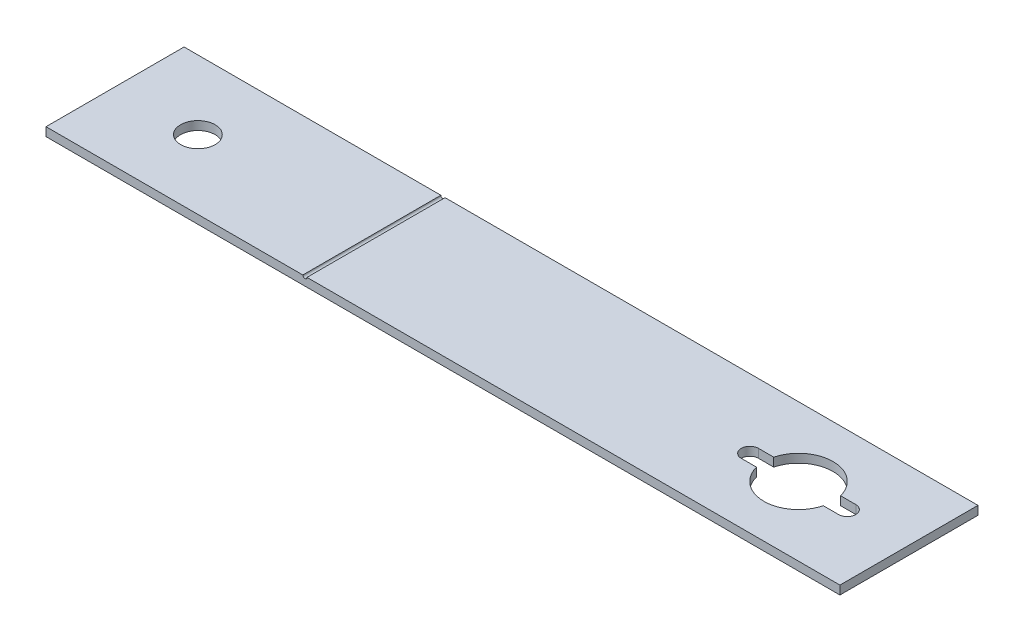
ISO-10303-21;
HEADER;
FILE_DESCRIPTION(('STEP AP214'),'2;1');
FILE_NAME('part.step','',(''),(''),'','','');
FILE_SCHEMA(('AUTOMOTIVE_DESIGN { 1 0 10303 214 1 1 1 1 }'));
ENDSEC;
DATA;
#1=APPLICATION_CONTEXT('core data for automotive mechanical design processes');
#2=APPLICATION_PROTOCOL_DEFINITION('international standard','automotive_design',2000,#1);
#3=PRODUCT_CONTEXT('',#1,'mechanical');
#4=PRODUCT('Part','Part','',(#3));
#5=PRODUCT_RELATED_PRODUCT_CATEGORY('part','',(#4));
#6=PRODUCT_DEFINITION_FORMATION('','',#4);
#7=PRODUCT_DEFINITION_CONTEXT('part definition',#1,'design');
#8=PRODUCT_DEFINITION('design','',#6,#7);
#9=PRODUCT_DEFINITION_SHAPE('','',#8);
#10=(LENGTH_UNIT() NAMED_UNIT(*) SI_UNIT(.MILLI.,.METRE.));
#11=(NAMED_UNIT(*) PLANE_ANGLE_UNIT() SI_UNIT($,.RADIAN.));
#12=(NAMED_UNIT(*) SI_UNIT($,.STERADIAN.) SOLID_ANGLE_UNIT());
#13=UNCERTAINTY_MEASURE_WITH_UNIT(LENGTH_MEASURE(1.E-05),#10,'distance_accuracy_value','');
#14=(GEOMETRIC_REPRESENTATION_CONTEXT(3) GLOBAL_UNCERTAINTY_ASSIGNED_CONTEXT((#13)) GLOBAL_UNIT_ASSIGNED_CONTEXT((#10,
#11,#12)) REPRESENTATION_CONTEXT('',''));
#15=CARTESIAN_POINT('',(0.,0.,0.));
#16=DIRECTION('',(0.,0.,1.));
#17=DIRECTION('',(1.,0.,0.));
#18=AXIS2_PLACEMENT_3D('',#15,#16,#17);
#19=CARTESIAN_POINT('',(0.,0.,0.));
#20=DIRECTION('',(0.,-1.,0.));
#21=DIRECTION('',(0.,0.,-1.));
#22=AXIS2_PLACEMENT_3D('',#19,#20,#21);
#23=PLANE('',#22);
#24=DIRECTION('',(1.,0.,0.));
#25=VECTOR('',#24,1.);
#26=CARTESIAN_POINT('',(43.7515,0.,1.5875));
#27=LINE('',#26,#25);
#28=CARTESIAN_POINT('',(43.7515,0.,1.5875));
#29=VERTEX_POINT('',#28);
#30=CARTESIAN_POINT('',(46.5566389378957,0.,1.5875));
#31=VERTEX_POINT('',#30);
#32=EDGE_CURVE('E243',#29,#31,#27,.T.);
#33=ORIENTED_EDGE('',*,*,#32,.F.);
#34=CARTESIAN_POINT('',(43.7515,0.,0.));
#35=DIRECTION('',(0.,1.,0.));
#36=DIRECTION('',(0.,0.,1.));
#37=AXIS2_PLACEMENT_3D('',#34,#35,#36);
#38=CIRCLE('',#37,1.5875);
#39=CARTESIAN_POINT('',(43.7515,0.,-1.5875));
#40=VERTEX_POINT('',#39);
#41=EDGE_CURVE('E245',#40,#29,#38,.T.);
#42=ORIENTED_EDGE('',*,*,#41,.F.);
#43=DIRECTION('',(-1.,0.,0.));
#44=VECTOR('',#43,1.);
#45=CARTESIAN_POINT('',(43.7515,0.,-1.5875));
#46=LINE('',#45,#44);
#47=CARTESIAN_POINT('',(46.5566389378957,0.,-1.5875));
#48=VERTEX_POINT('',#47);
#49=EDGE_CURVE('E213',#48,#40,#46,.T.);
#50=ORIENTED_EDGE('',*,*,#49,.F.);
#51=CARTESIAN_POINT('',(52.705,0.,0.));
#52=DIRECTION('',(0.,1.,0.));
#53=DIRECTION('',(0.,0.,1.));
#54=AXIS2_PLACEMENT_3D('',#51,#52,#53);
#55=CIRCLE('',#54,6.35);
#56=CARTESIAN_POINT('',(58.8533610621043,0.,-1.5875));
#57=VERTEX_POINT('',#56);
#58=EDGE_CURVE('E228',#57,#48,#55,.T.);
#59=ORIENTED_EDGE('',*,*,#58,.F.);
#60=DIRECTION('',(-1.,0.,0.));
#61=VECTOR('',#60,1.);
#62=CARTESIAN_POINT('',(61.6585,0.,-1.5875));
#63=LINE('',#62,#61);
#64=CARTESIAN_POINT('',(61.6585,0.,-1.5875));
#65=VERTEX_POINT('',#64);
#66=EDGE_CURVE('E231',#65,#57,#63,.T.);
#67=ORIENTED_EDGE('',*,*,#66,.F.);
#68=CARTESIAN_POINT('',(61.6585,0.,0.));
#69=DIRECTION('',(0.,1.,0.));
#70=DIRECTION('',(0.,0.,1.));
#71=AXIS2_PLACEMENT_3D('',#68,#69,#70);
#72=CIRCLE('',#71,1.5875);
#73=CARTESIAN_POINT('',(61.6585,0.,1.5875));
#74=VERTEX_POINT('',#73);
#75=EDGE_CURVE('E234',#74,#65,#72,.T.);
#76=ORIENTED_EDGE('',*,*,#75,.F.);
#77=DIRECTION('',(1.,0.,0.));
#78=VECTOR('',#77,1.);
#79=CARTESIAN_POINT('',(61.6585,0.,1.5875));
#80=LINE('',#79,#78);
#81=CARTESIAN_POINT('',(58.8533610621043,0.,1.5875));
#82=VERTEX_POINT('',#81);
#83=EDGE_CURVE('E237',#82,#74,#80,.T.);
#84=ORIENTED_EDGE('',*,*,#83,.F.);
#85=CARTESIAN_POINT('',(52.705,0.,0.));
#86=DIRECTION('',(0.,1.,0.));
#87=DIRECTION('',(0.,0.,1.));
#88=AXIS2_PLACEMENT_3D('',#85,#86,#87);
#89=CIRCLE('',#88,6.35);
#90=EDGE_CURVE('E240',#31,#82,#89,.T.);
#91=ORIENTED_EDGE('',*,*,#90,.F.);
#92=EDGE_LOOP('',(#33,#42,#50,#59,#67,#76,#84,#91));
#93=FACE_BOUND('',#92,.T.);
#94=DIRECTION('',(-1.,0.,0.));
#95=VECTOR('',#94,1.);
#96=CARTESIAN_POINT('',(-73.025,0.,-12.7));
#97=LINE('',#96,#95);
#98=CARTESIAN_POINT('',(73.025,0.,-12.7));
#99=VERTEX_POINT('',#98);
#100=CARTESIAN_POINT('',(-25.0177724064553,0.,-12.7));
#101=VERTEX_POINT('',#100);
#102=EDGE_CURVE('E147',#99,#101,#97,.T.);
#103=ORIENTED_EDGE('',*,*,#102,.T.);
#104=DIRECTION('',(0.,0.,1.));
#105=VECTOR('',#104,1.);
#106=CARTESIAN_POINT('',(-25.0177724064553,0.,-12.954));
#107=LINE('',#106,#105);
#108=CARTESIAN_POINT('',(-25.0177724064553,0.,12.7));
#109=VERTEX_POINT('',#108);
#110=EDGE_CURVE('E11',#101,#109,#107,.T.);
#111=ORIENTED_EDGE('',*,*,#110,.T.);
#112=DIRECTION('',(1.,0.,0.));
#113=VECTOR('',#112,1.);
#114=CARTESIAN_POINT('',(-73.025,0.,12.7));
#115=LINE('',#114,#113);
#116=CARTESIAN_POINT('',(73.025,0.,12.7));
#117=VERTEX_POINT('',#116);
#118=EDGE_CURVE('E144',#109,#117,#115,.T.);
#119=ORIENTED_EDGE('',*,*,#118,.T.);
#120=DIRECTION('',(0.,0.,-1.));
#121=VECTOR('',#120,1.);
#122=CARTESIAN_POINT('',(73.025,0.,12.7));
#123=LINE('',#122,#121);
#124=EDGE_CURVE('E176',#117,#99,#123,.T.);
#125=ORIENTED_EDGE('',*,*,#124,.T.);
#126=EDGE_LOOP('',(#103,#111,#119,#125));
#127=FACE_BOUND('',#126,.T.);
#128=ADVANCED_FACE('F35',(#93,#127),#23,.F.);
#129=CARTESIAN_POINT('',(73.025,-1.5875,12.7));
#130=DIRECTION('',(1.,0.,0.));
#131=DIRECTION('',(0.,0.,-1.));
#132=AXIS2_PLACEMENT_3D('',#129,#130,#131);
#133=PLANE('',#132);
#134=ORIENTED_EDGE('',*,*,#124,.F.);
#135=DIRECTION('',(0.,1.,0.));
#136=VECTOR('',#135,1.);
#137=CARTESIAN_POINT('',(73.025,-1.5875,12.7));
#138=LINE('',#137,#136);
#139=CARTESIAN_POINT('',(73.025,-1.5875,12.7));
#140=VERTEX_POINT('',#139);
#141=EDGE_CURVE('E150',#140,#117,#138,.T.);
#142=ORIENTED_EDGE('',*,*,#141,.F.);
#143=DIRECTION('',(0.,0.,-1.));
#144=VECTOR('',#143,1.);
#145=CARTESIAN_POINT('',(73.025,-1.5875,12.7));
#146=LINE('',#145,#144);
#147=CARTESIAN_POINT('',(73.025,-1.5875,-12.7));
#148=VERTEX_POINT('',#147);
#149=EDGE_CURVE('E155',#140,#148,#146,.T.);
#150=ORIENTED_EDGE('',*,*,#149,.T.);
#151=DIRECTION('',(0.,1.,0.));
#152=VECTOR('',#151,1.);
#153=CARTESIAN_POINT('',(73.025,-1.5875,-12.7));
#154=LINE('',#153,#152);
#155=EDGE_CURVE('E166',#148,#99,#154,.T.);
#156=ORIENTED_EDGE('',*,*,#155,.T.);
#157=EDGE_LOOP('',(#134,#142,#150,#156));
#158=FACE_BOUND('',#157,.T.);
#159=ADVANCED_FACE('F37',(#158),#133,.T.);
#160=CARTESIAN_POINT('',(-73.025,-1.5875,12.7));
#161=DIRECTION('',(0.,0.,1.));
#162=DIRECTION('',(1.,0.,0.));
#163=AXIS2_PLACEMENT_3D('',#160,#161,#162);
#164=PLANE('',#163);
#165=CARTESIAN_POINT('',(-25.3987724064553,0.,12.7));
#166=DIRECTION('',(0.,0.,1.));
#167=DIRECTION('',(1.,0.,0.));
#168=AXIS2_PLACEMENT_3D('',#165,#166,#167);
#169=CIRCLE('',#168,0.380999999999998);
#170=CARTESIAN_POINT('',(-25.7797724064553,0.,12.7));
#171=VERTEX_POINT('',#170);
#172=EDGE_CURVE('E134',#171,#109,#169,.T.);
#173=ORIENTED_EDGE('',*,*,#172,.F.);
#174=CARTESIAN_POINT('',(-73.025,0.,12.7));
#175=VERTEX_POINT('',#174);
#176=EDGE_CURVE('E152',#175,#171,#115,.T.);
#177=ORIENTED_EDGE('',*,*,#176,.F.);
#178=DIRECTION('',(0.,1.,0.));
#179=VECTOR('',#178,1.);
#180=CARTESIAN_POINT('',(-73.025,-1.5875,12.7));
#181=LINE('',#180,#179);
#182=CARTESIAN_POINT('',(-73.025,-1.5875,12.7));
#183=VERTEX_POINT('',#182);
#184=EDGE_CURVE('E161',#183,#175,#181,.T.);
#185=ORIENTED_EDGE('',*,*,#184,.F.);
#186=DIRECTION('',(1.,0.,0.));
#187=VECTOR('',#186,1.);
#188=CARTESIAN_POINT('',(-73.025,-1.5875,12.7));
#189=LINE('',#188,#187);
#190=EDGE_CURVE('E167',#183,#140,#189,.T.);
#191=ORIENTED_EDGE('',*,*,#190,.T.);
#192=ORIENTED_EDGE('',*,*,#141,.T.);
#193=ORIENTED_EDGE('',*,*,#118,.F.);
#194=EDGE_LOOP('',(#173,#177,#185,#191,#192,#193));
#195=FACE_BOUND('',#194,.T.);
#196=ADVANCED_FACE('F148',(#195),#164,.T.);
#197=CARTESIAN_POINT('',(-73.025,-1.5875,12.7));
#198=DIRECTION('',(-1.,0.,0.));
#199=DIRECTION('',(0.,0.,1.));
#200=AXIS2_PLACEMENT_3D('',#197,#198,#199);
#201=PLANE('',#200);
#202=DIRECTION('',(0.,0.,1.));
#203=VECTOR('',#202,1.);
#204=CARTESIAN_POINT('',(-73.025,0.,12.7));
#205=LINE('',#204,#203);
#206=CARTESIAN_POINT('',(-73.025,0.,-12.7));
#207=VERTEX_POINT('',#206);
#208=EDGE_CURVE('E153',#207,#175,#205,.T.);
#209=ORIENTED_EDGE('',*,*,#208,.F.);
#210=DIRECTION('',(0.,1.,0.));
#211=VECTOR('',#210,1.);
#212=CARTESIAN_POINT('',(-73.025,-1.5875,-12.7));
#213=LINE('',#212,#211);
#214=CARTESIAN_POINT('',(-73.025,-1.5875,-12.7));
#215=VERTEX_POINT('',#214);
#216=EDGE_CURVE('E163',#215,#207,#213,.T.);
#217=ORIENTED_EDGE('',*,*,#216,.F.);
#218=DIRECTION('',(0.,0.,1.));
#219=VECTOR('',#218,1.);
#220=CARTESIAN_POINT('',(-73.025,-1.5875,12.7));
#221=LINE('',#220,#219);
#222=EDGE_CURVE('E181',#215,#183,#221,.T.);
#223=ORIENTED_EDGE('',*,*,#222,.T.);
#224=ORIENTED_EDGE('',*,*,#184,.T.);
#225=EDGE_LOOP('',(#209,#217,#223,#224));
#226=FACE_BOUND('',#225,.T.);
#227=ADVANCED_FACE('F319',(#226),#201,.T.);
#228=CARTESIAN_POINT('',(-73.025,-1.5875,-12.7));
#229=DIRECTION('',(0.,0.,-1.));
#230=DIRECTION('',(-1.,0.,0.));
#231=AXIS2_PLACEMENT_3D('',#228,#229,#230);
#232=PLANE('',#231);
#233=CARTESIAN_POINT('',(-25.3987724064553,0.,-12.7));
#234=DIRECTION('',(0.,0.,-1.));
#235=DIRECTION('',(-1.,0.,0.));
#236=AXIS2_PLACEMENT_3D('',#233,#234,#235);
#237=CIRCLE('',#236,0.380999999999998);
#238=CARTESIAN_POINT('',(-25.7797724064553,0.,-12.7));
#239=VERTEX_POINT('',#238);
#240=EDGE_CURVE('E50',#101,#239,#237,.T.);
#241=ORIENTED_EDGE('',*,*,#240,.F.);
#242=ORIENTED_EDGE('',*,*,#102,.F.);
#243=ORIENTED_EDGE('',*,*,#155,.F.);
#244=DIRECTION('',(-1.,0.,0.));
#245=VECTOR('',#244,1.);
#246=CARTESIAN_POINT('',(-73.025,-1.5875,-12.7));
#247=LINE('',#246,#245);
#248=EDGE_CURVE('E184',#148,#215,#247,.T.);
#249=ORIENTED_EDGE('',*,*,#248,.T.);
#250=ORIENTED_EDGE('',*,*,#216,.T.);
#251=EDGE_CURVE('E171',#239,#207,#97,.T.);
#252=ORIENTED_EDGE('',*,*,#251,.F.);
#253=EDGE_LOOP('',(#241,#242,#243,#249,#250,#252));
#254=FACE_BOUND('',#253,.T.);
#255=ADVANCED_FACE('F173',(#254),#232,.T.);
#256=CARTESIAN_POINT('',(0.,-1.5875,0.));
#257=DIRECTION('',(0.,-1.,0.));
#258=DIRECTION('',(0.,0.,-1.));
#259=AXIS2_PLACEMENT_3D('',#256,#257,#258);
#260=PLANE('',#259);
#261=CARTESIAN_POINT('',(43.7515,-1.5875,0.));
#262=DIRECTION('',(0.,-1.,0.));
#263=DIRECTION('',(0.,0.,-1.));
#264=AXIS2_PLACEMENT_3D('',#261,#262,#263);
#265=CIRCLE('',#264,1.5875);
#266=CARTESIAN_POINT('',(43.7515,-1.5875,1.5875));
#267=VERTEX_POINT('',#266);
#268=CARTESIAN_POINT('',(43.7515,-1.5875,-1.5875));
#269=VERTEX_POINT('',#268);
#270=EDGE_CURVE('E193',#267,#269,#265,.T.);
#271=ORIENTED_EDGE('',*,*,#270,.F.);
#272=DIRECTION('',(-1.,0.,0.));
#273=VECTOR('',#272,1.);
#274=CARTESIAN_POINT('',(0.,-1.5875,1.5875));
#275=LINE('',#274,#273);
#276=CARTESIAN_POINT('',(46.5566389378957,-1.5875,1.5875));
#277=VERTEX_POINT('',#276);
#278=EDGE_CURVE('E207',#277,#267,#275,.T.);
#279=ORIENTED_EDGE('',*,*,#278,.F.);
#280=CARTESIAN_POINT('',(52.705,-1.5875,0.));
#281=DIRECTION('',(0.,-1.,0.));
#282=DIRECTION('',(0.,0.,-1.));
#283=AXIS2_PLACEMENT_3D('',#280,#281,#282);
#284=CIRCLE('',#283,6.35);
#285=CARTESIAN_POINT('',(58.8533610621043,-1.5875,1.5875));
#286=VERTEX_POINT('',#285);
#287=EDGE_CURVE('E205',#286,#277,#284,.T.);
#288=ORIENTED_EDGE('',*,*,#287,.F.);
#289=DIRECTION('',(-1.,0.,0.));
#290=VECTOR('',#289,1.);
#291=CARTESIAN_POINT('',(0.,-1.5875,1.5875));
#292=LINE('',#291,#290);
#293=CARTESIAN_POINT('',(61.6585,-1.5875,1.5875));
#294=VERTEX_POINT('',#293);
#295=EDGE_CURVE('E203',#294,#286,#292,.T.);
#296=ORIENTED_EDGE('',*,*,#295,.F.);
#297=CARTESIAN_POINT('',(61.6585,-1.5875,0.));
#298=DIRECTION('',(0.,-1.,0.));
#299=DIRECTION('',(0.,0.,-1.));
#300=AXIS2_PLACEMENT_3D('',#297,#298,#299);
#301=CIRCLE('',#300,1.5875);
#302=CARTESIAN_POINT('',(61.6585,-1.5875,-1.5875));
#303=VERTEX_POINT('',#302);
#304=EDGE_CURVE('E201',#303,#294,#301,.T.);
#305=ORIENTED_EDGE('',*,*,#304,.F.);
#306=DIRECTION('',(1.,0.,0.));
#307=VECTOR('',#306,1.);
#308=CARTESIAN_POINT('',(0.,-1.5875,-1.58749999999999));
#309=LINE('',#308,#307);
#310=CARTESIAN_POINT('',(58.8533610621043,-1.5875,-1.5875));
#311=VERTEX_POINT('',#310);
#312=EDGE_CURVE('E199',#311,#303,#309,.T.);
#313=ORIENTED_EDGE('',*,*,#312,.F.);
#314=CARTESIAN_POINT('',(52.705,-1.5875,0.));
#315=DIRECTION('',(0.,-1.,0.));
#316=DIRECTION('',(0.,0.,-1.));
#317=AXIS2_PLACEMENT_3D('',#314,#315,#316);
#318=CIRCLE('',#317,6.35);
#319=CARTESIAN_POINT('',(46.5566389378957,-1.5875,-1.5875));
#320=VERTEX_POINT('',#319);
#321=EDGE_CURVE('E197',#320,#311,#318,.T.);
#322=ORIENTED_EDGE('',*,*,#321,.F.);
#323=DIRECTION('',(1.,0.,0.));
#324=VECTOR('',#323,1.);
#325=CARTESIAN_POINT('',(0.,-1.5875,-1.5875));
#326=LINE('',#325,#324);
#327=EDGE_CURVE('E195',#269,#320,#326,.T.);
#328=ORIENTED_EDGE('',*,*,#327,.F.);
#329=EDGE_LOOP('',(#271,#279,#288,#296,#305,#313,#322,#328));
#330=FACE_BOUND('',#329,.T.);
#331=CARTESIAN_POINT('',(-57.785,-1.5875,0.));
#332=DIRECTION('',(0.,-1.,0.));
#333=DIRECTION('',(0.,0.,-1.));
#334=AXIS2_PLACEMENT_3D('',#331,#332,#333);
#335=CIRCLE('',#334,3.175);
#336=CARTESIAN_POINT('',(-57.785,-1.5875,-3.175));
#337=VERTEX_POINT('',#336);
#338=EDGE_CURVE('E177',#337,#337,#335,.T.);
#339=ORIENTED_EDGE('',*,*,#338,.F.);
#340=EDGE_LOOP('',(#339));
#341=FACE_BOUND('',#340,.T.);
#342=ORIENTED_EDGE('',*,*,#149,.F.);
#343=ORIENTED_EDGE('',*,*,#190,.F.);
#344=ORIENTED_EDGE('',*,*,#222,.F.);
#345=ORIENTED_EDGE('',*,*,#248,.F.);
#346=EDGE_LOOP('',(#342,#343,#344,#345));
#347=FACE_BOUND('',#346,.T.);
#348=ADVANCED_FACE('F267',(#330,#341,#347),#260,.T.);
#349=CARTESIAN_POINT('',(-57.785,0.,0.));
#350=DIRECTION('',(0.,1.,0.));
#351=DIRECTION('',(0.,0.,1.));
#352=AXIS2_PLACEMENT_3D('',#349,#350,#351);
#353=CIRCLE('',#352,3.175);
#354=CARTESIAN_POINT('',(-57.785,0.,3.175));
#355=VERTEX_POINT('',#354);
#356=EDGE_CURVE('E190',#355,#355,#353,.T.);
#357=ORIENTED_EDGE('',*,*,#356,.F.);
#358=EDGE_LOOP('',(#357));
#359=FACE_BOUND('',#358,.T.);
#360=ORIENTED_EDGE('',*,*,#176,.T.);
#361=DIRECTION('',(0.,0.,1.));
#362=VECTOR('',#361,1.);
#363=CARTESIAN_POINT('',(-25.7797724064553,0.,-12.954));
#364=LINE('',#363,#362);
#365=EDGE_CURVE('E43',#171,#239,#364,.F.);
#366=ORIENTED_EDGE('',*,*,#365,.T.);
#367=ORIENTED_EDGE('',*,*,#251,.T.);
#368=ORIENTED_EDGE('',*,*,#208,.T.);
#369=EDGE_LOOP('',(#360,#366,#367,#368));
#370=FACE_BOUND('',#369,.T.);
#371=ADVANCED_FACE('F170',(#359,#370),#23,.F.);
#372=CARTESIAN_POINT('',(-57.785,-2.54,0.));
#373=DIRECTION('',(0.,1.,0.));
#374=DIRECTION('',(0.,0.,1.));
#375=AXIS2_PLACEMENT_3D('',#372,#373,#374);
#376=CYLINDRICAL_SURFACE('',#375,3.175);
#377=ORIENTED_EDGE('',*,*,#338,.T.);
#378=EDGE_LOOP('',(#377));
#379=FACE_BOUND('',#378,.T.);
#380=ORIENTED_EDGE('',*,*,#356,.T.);
#381=EDGE_LOOP('',(#380));
#382=FACE_BOUND('',#381,.T.);
#383=ADVANCED_FACE('F306',(#379,#382),#376,.F.);
#384=CARTESIAN_POINT('',(43.7515,-2.54,0.));
#385=DIRECTION('',(0.,1.,0.));
#386=DIRECTION('',(0.,0.,1.));
#387=AXIS2_PLACEMENT_3D('',#384,#385,#386);
#388=CYLINDRICAL_SURFACE('',#387,1.5875);
#389=ORIENTED_EDGE('',*,*,#270,.T.);
#390=DIRECTION('',(0.,1.,0.));
#391=VECTOR('',#390,1.);
#392=CARTESIAN_POINT('',(43.7515,-2.54,-1.5875));
#393=LINE('',#392,#391);
#394=EDGE_CURVE('E209',#269,#40,#393,.T.);
#395=ORIENTED_EDGE('',*,*,#394,.T.);
#396=ORIENTED_EDGE('',*,*,#41,.T.);
#397=DIRECTION('',(0.,1.,0.));
#398=VECTOR('',#397,1.);
#399=CARTESIAN_POINT('',(43.7515,-2.54,1.5875));
#400=LINE('',#399,#398);
#401=EDGE_CURVE('E210',#267,#29,#400,.T.);
#402=ORIENTED_EDGE('',*,*,#401,.F.);
#403=EDGE_LOOP('',(#389,#395,#396,#402));
#404=FACE_BOUND('',#403,.T.);
#405=ADVANCED_FACE('F250',(#404),#388,.F.);
#406=CARTESIAN_POINT('',(43.7515,-2.54,-1.5875));
#407=DIRECTION('',(0.,0.,-1.));
#408=DIRECTION('',(-1.,0.,0.));
#409=AXIS2_PLACEMENT_3D('',#406,#407,#408);
#410=PLANE('',#409);
#411=ORIENTED_EDGE('',*,*,#327,.T.);
#412=DIRECTION('',(0.,1.,0.));
#413=VECTOR('',#412,1.);
#414=CARTESIAN_POINT('',(46.5566389378957,-2.54,-1.5875));
#415=LINE('',#414,#413);
#416=EDGE_CURVE('E223',#320,#48,#415,.T.);
#417=ORIENTED_EDGE('',*,*,#416,.T.);
#418=ORIENTED_EDGE('',*,*,#49,.T.);
#419=ORIENTED_EDGE('',*,*,#394,.F.);
#420=EDGE_LOOP('',(#411,#417,#418,#419));
#421=FACE_BOUND('',#420,.T.);
#422=ADVANCED_FACE('F272',(#421),#410,.F.);
#423=CARTESIAN_POINT('',(52.705,-2.54,0.));
#424=DIRECTION('',(0.,1.,0.));
#425=DIRECTION('',(0.,0.,1.));
#426=AXIS2_PLACEMENT_3D('',#423,#424,#425);
#427=CYLINDRICAL_SURFACE('',#426,6.35);
#428=ORIENTED_EDGE('',*,*,#321,.T.);
#429=DIRECTION('',(0.,1.,0.));
#430=VECTOR('',#429,1.);
#431=CARTESIAN_POINT('',(58.8533610621043,-2.54,-1.5875));
#432=LINE('',#431,#430);
#433=EDGE_CURVE('E221',#311,#57,#432,.T.);
#434=ORIENTED_EDGE('',*,*,#433,.T.);
#435=ORIENTED_EDGE('',*,*,#58,.T.);
#436=ORIENTED_EDGE('',*,*,#416,.F.);
#437=EDGE_LOOP('',(#428,#434,#435,#436));
#438=FACE_BOUND('',#437,.T.);
#439=ADVANCED_FACE('F277',(#438),#427,.F.);
#440=CARTESIAN_POINT('',(61.6585,-2.54,-1.5875));
#441=DIRECTION('',(0.,0.,-1.));
#442=DIRECTION('',(-1.,0.,0.));
#443=AXIS2_PLACEMENT_3D('',#440,#441,#442);
#444=PLANE('',#443);
#445=ORIENTED_EDGE('',*,*,#312,.T.);
#446=DIRECTION('',(0.,1.,0.));
#447=VECTOR('',#446,1.);
#448=CARTESIAN_POINT('',(61.6585,-2.54,-1.5875));
#449=LINE('',#448,#447);
#450=EDGE_CURVE('E219',#303,#65,#449,.T.);
#451=ORIENTED_EDGE('',*,*,#450,.T.);
#452=ORIENTED_EDGE('',*,*,#66,.T.);
#453=ORIENTED_EDGE('',*,*,#433,.F.);
#454=EDGE_LOOP('',(#445,#451,#452,#453));
#455=FACE_BOUND('',#454,.T.);
#456=ADVANCED_FACE('F281',(#455),#444,.F.);
#457=CARTESIAN_POINT('',(61.6585,-2.54,0.));
#458=DIRECTION('',(0.,1.,0.));
#459=DIRECTION('',(0.,0.,1.));
#460=AXIS2_PLACEMENT_3D('',#457,#458,#459);
#461=CYLINDRICAL_SURFACE('',#460,1.5875);
#462=ORIENTED_EDGE('',*,*,#304,.T.);
#463=DIRECTION('',(0.,1.,0.));
#464=VECTOR('',#463,1.);
#465=CARTESIAN_POINT('',(61.6585,-2.54,1.5875));
#466=LINE('',#465,#464);
#467=EDGE_CURVE('E217',#294,#74,#466,.T.);
#468=ORIENTED_EDGE('',*,*,#467,.T.);
#469=ORIENTED_EDGE('',*,*,#75,.T.);
#470=ORIENTED_EDGE('',*,*,#450,.F.);
#471=EDGE_LOOP('',(#462,#468,#469,#470));
#472=FACE_BOUND('',#471,.T.);
#473=ADVANCED_FACE('F285',(#472),#461,.F.);
#474=CARTESIAN_POINT('',(61.6585,-2.54,1.5875));
#475=DIRECTION('',(0.,0.,1.));
#476=DIRECTION('',(1.,0.,0.));
#477=AXIS2_PLACEMENT_3D('',#474,#475,#476);
#478=PLANE('',#477);
#479=ORIENTED_EDGE('',*,*,#295,.T.);
#480=DIRECTION('',(0.,1.,0.));
#481=VECTOR('',#480,1.);
#482=CARTESIAN_POINT('',(58.8533610621043,-2.54,1.5875));
#483=LINE('',#482,#481);
#484=EDGE_CURVE('E215',#286,#82,#483,.T.);
#485=ORIENTED_EDGE('',*,*,#484,.T.);
#486=ORIENTED_EDGE('',*,*,#83,.T.);
#487=ORIENTED_EDGE('',*,*,#467,.F.);
#488=EDGE_LOOP('',(#479,#485,#486,#487));
#489=FACE_BOUND('',#488,.T.);
#490=ADVANCED_FACE('F288',(#489),#478,.F.);
#491=CARTESIAN_POINT('',(52.705,-2.54,0.));
#492=DIRECTION('',(0.,1.,0.));
#493=DIRECTION('',(0.,0.,1.));
#494=AXIS2_PLACEMENT_3D('',#491,#492,#493);
#495=CYLINDRICAL_SURFACE('',#494,6.35);
#496=ORIENTED_EDGE('',*,*,#287,.T.);
#497=DIRECTION('',(0.,1.,0.));
#498=VECTOR('',#497,1.);
#499=CARTESIAN_POINT('',(46.5566389378957,-2.54,1.5875));
#500=LINE('',#499,#498);
#501=EDGE_CURVE('E58',#277,#31,#500,.T.);
#502=ORIENTED_EDGE('',*,*,#501,.T.);
#503=ORIENTED_EDGE('',*,*,#90,.T.);
#504=ORIENTED_EDGE('',*,*,#484,.F.);
#505=EDGE_LOOP('',(#496,#502,#503,#504));
#506=FACE_BOUND('',#505,.T.);
#507=ADVANCED_FACE('F263',(#506),#495,.F.);
#508=CARTESIAN_POINT('',(43.7515,-2.54,1.5875));
#509=DIRECTION('',(0.,0.,1.));
#510=DIRECTION('',(1.,0.,0.));
#511=AXIS2_PLACEMENT_3D('',#508,#509,#510);
#512=PLANE('',#511);
#513=ORIENTED_EDGE('',*,*,#278,.T.);
#514=ORIENTED_EDGE('',*,*,#401,.T.);
#515=ORIENTED_EDGE('',*,*,#32,.T.);
#516=ORIENTED_EDGE('',*,*,#501,.F.);
#517=EDGE_LOOP('',(#513,#514,#515,#516));
#518=FACE_BOUND('',#517,.T.);
#519=ADVANCED_FACE('F256',(#518),#512,.F.);
#520=CARTESIAN_POINT('',(-25.3987724064553,0.,-12.954));
#521=DIRECTION('',(0.,0.,1.));
#522=DIRECTION('',(1.,0.,0.));
#523=AXIS2_PLACEMENT_3D('',#520,#521,#522);
#524=CYLINDRICAL_SURFACE('',#523,0.380999999999998);
#525=ORIENTED_EDGE('',*,*,#240,.T.);
#526=ORIENTED_EDGE('',*,*,#365,.F.);
#527=ORIENTED_EDGE('',*,*,#172,.T.);
#528=ORIENTED_EDGE('',*,*,#110,.F.);
#529=EDGE_LOOP('',(#525,#526,#527,#528));
#530=FACE_BOUND('',#529,.T.);
#531=ADVANCED_FACE('F135',(#530),#524,.F.);
#532=CLOSED_SHELL('',(#128,#159,#196,#227,#255,#348,#371,#383,#405,#422,#439,#456,#473,#490,
#507,#519,#531));
#533=MANIFOLD_SOLID_BREP('B2',#532);
#534=ADVANCED_BREP_SHAPE_REPRESENTATION('',(#18,#533),#14);
#535=SHAPE_DEFINITION_REPRESENTATION(#9,#534);
ENDSEC;
END-ISO-10303-21;
